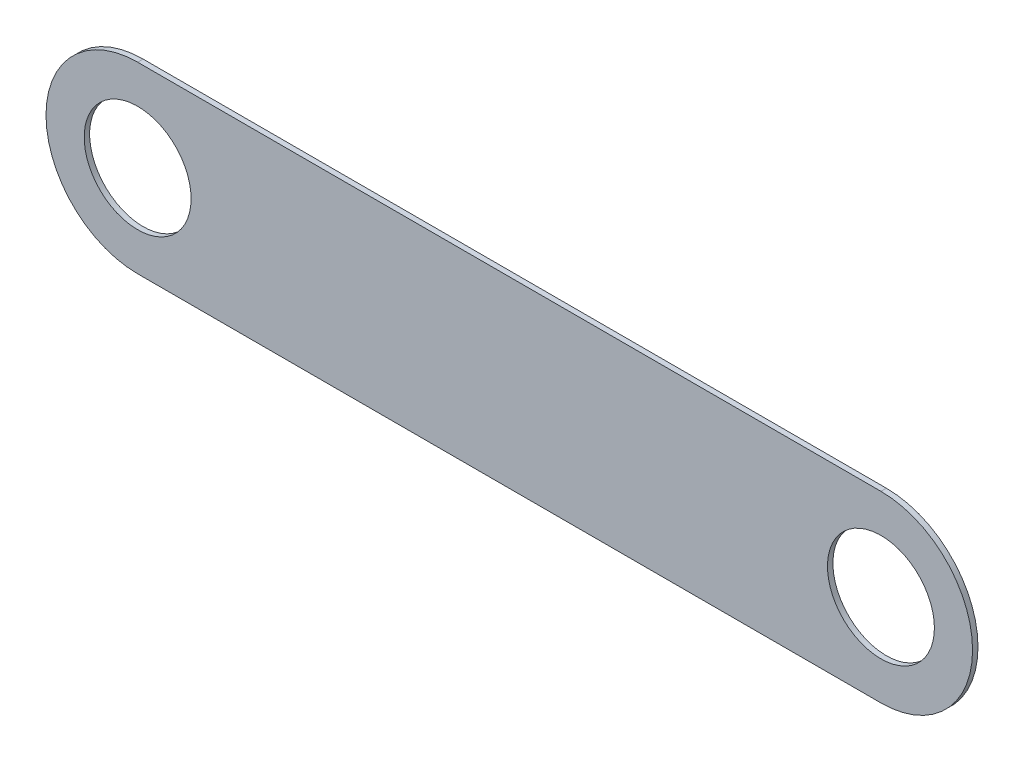
ISO-10303-21;
HEADER;
FILE_DESCRIPTION(('STEP AP214'),'2;1');
FILE_NAME('part.step','',(''),(''),'','','');
FILE_SCHEMA(('AUTOMOTIVE_DESIGN { 1 0 10303 214 1 1 1 1 }'));
ENDSEC;
DATA;
#1=APPLICATION_CONTEXT('core data for automotive mechanical design processes');
#2=APPLICATION_PROTOCOL_DEFINITION('international standard','automotive_design',2000,#1);
#3=PRODUCT_CONTEXT('',#1,'mechanical');
#4=PRODUCT('Part','Part','',(#3));
#5=PRODUCT_RELATED_PRODUCT_CATEGORY('part','',(#4));
#6=PRODUCT_DEFINITION_FORMATION('','',#4);
#7=PRODUCT_DEFINITION_CONTEXT('part definition',#1,'design');
#8=PRODUCT_DEFINITION('design','',#6,#7);
#9=PRODUCT_DEFINITION_SHAPE('','',#8);
#10=(LENGTH_UNIT() NAMED_UNIT(*) SI_UNIT(.MILLI.,.METRE.));
#11=(NAMED_UNIT(*) PLANE_ANGLE_UNIT() SI_UNIT($,.RADIAN.));
#12=(NAMED_UNIT(*) SI_UNIT($,.STERADIAN.) SOLID_ANGLE_UNIT());
#13=UNCERTAINTY_MEASURE_WITH_UNIT(LENGTH_MEASURE(1.E-05),#10,'distance_accuracy_value','');
#14=(GEOMETRIC_REPRESENTATION_CONTEXT(3) GLOBAL_UNCERTAINTY_ASSIGNED_CONTEXT((#13)) GLOBAL_UNIT_ASSIGNED_CONTEXT((#10,
#11,#12)) REPRESENTATION_CONTEXT('',''));
#15=CARTESIAN_POINT('',(0.,0.,0.));
#16=DIRECTION('',(0.,0.,1.));
#17=DIRECTION('',(1.,0.,0.));
#18=AXIS2_PLACEMENT_3D('',#15,#16,#17);
#19=CARTESIAN_POINT('',(115.3333736,94.6999884,0.));
#20=DIRECTION('',(0.,1.,0.));
#21=DIRECTION('',(1.,0.,0.));
#22=AXIS2_PLACEMENT_3D('',#19,#20,#21);
#23=PLANE('',#22);
#24=DIRECTION('',(1.,0.,0.));
#25=VECTOR('',#24,1.);
#26=CARTESIAN_POINT('',(115.3333736,94.6999884,0.03556));
#27=LINE('',#26,#25);
#28=CARTESIAN_POINT('',(115.3333736,94.6999884,0.03556));
#29=VERTEX_POINT('',#28);
#30=CARTESIAN_POINT('',(120.1999628,94.6999884,0.03556));
#31=VERTEX_POINT('',#30);
#32=EDGE_CURVE('E11',#29,#31,#27,.T.);
#33=ORIENTED_EDGE('',*,*,#32,.F.);
#34=DIRECTION('',(0.,0.,1.));
#35=VECTOR('',#34,1.);
#36=CARTESIAN_POINT('',(115.3333736,94.6999884,0.));
#37=LINE('',#36,#35);
#38=CARTESIAN_POINT('',(115.3333736,94.6999884,0.));
#39=VERTEX_POINT('',#38);
#40=EDGE_CURVE('E24',#39,#29,#37,.T.);
#41=ORIENTED_EDGE('',*,*,#40,.F.);
#42=DIRECTION('',(1.,0.,0.));
#43=VECTOR('',#42,1.);
#44=CARTESIAN_POINT('',(115.3333736,94.6999884,0.));
#45=LINE('',#44,#43);
#46=CARTESIAN_POINT('',(120.1999628,94.6999884,0.));
#47=VERTEX_POINT('',#46);
#48=EDGE_CURVE('E110',#39,#47,#45,.T.);
#49=ORIENTED_EDGE('',*,*,#48,.T.);
#50=DIRECTION('',(0.,0.,1.));
#51=VECTOR('',#50,1.);
#52=CARTESIAN_POINT('',(120.1999628,94.6999884,0.));
#53=LINE('',#52,#51);
#54=EDGE_CURVE('E37',#47,#31,#53,.T.);
#55=ORIENTED_EDGE('',*,*,#54,.T.);
#56=EDGE_LOOP('',(#33,#41,#49,#55));
#57=FACE_BOUND('',#56,.T.);
#58=ADVANCED_FACE('F17',(#57),#23,.F.);
#59=CARTESIAN_POINT('',(115.3333736,95.2999872,0.));
#60=DIRECTION('',(0.,0.,-1.));
#61=DIRECTION('',(0.,1.,0.));
#62=AXIS2_PLACEMENT_3D('',#59,#60,#61);
#63=CYLINDRICAL_SURFACE('',#62,0.599998799999999);
#64=CARTESIAN_POINT('',(115.3333736,95.2999872,0.03556));
#65=DIRECTION('',(0.,0.,1.));
#66=DIRECTION('',(0.,1.,0.));
#67=AXIS2_PLACEMENT_3D('',#64,#65,#66);
#68=CIRCLE('',#67,0.599998799999999);
#69=CARTESIAN_POINT('',(115.3333736,95.899986,0.03556));
#70=VERTEX_POINT('',#69);
#71=EDGE_CURVE('E106',#70,#29,#68,.T.);
#72=ORIENTED_EDGE('',*,*,#71,.F.);
#73=DIRECTION('',(0.,0.,1.));
#74=VECTOR('',#73,1.);
#75=CARTESIAN_POINT('',(115.3333736,95.899986,0.));
#76=LINE('',#75,#74);
#77=CARTESIAN_POINT('',(115.3333736,95.899986,0.));
#78=VERTEX_POINT('',#77);
#79=EDGE_CURVE('E104',#78,#70,#76,.T.);
#80=ORIENTED_EDGE('',*,*,#79,.F.);
#81=CARTESIAN_POINT('',(115.3333736,95.2999872,0.));
#82=DIRECTION('',(0.,0.,1.));
#83=DIRECTION('',(0.,1.,0.));
#84=AXIS2_PLACEMENT_3D('',#81,#82,#83);
#85=CIRCLE('',#84,0.599998799999999);
#86=EDGE_CURVE('E102',#78,#39,#85,.T.);
#87=ORIENTED_EDGE('',*,*,#86,.T.);
#88=ORIENTED_EDGE('',*,*,#40,.T.);
#89=EDGE_LOOP('',(#72,#80,#87,#88));
#90=FACE_BOUND('',#89,.T.);
#91=ADVANCED_FACE('F126',(#90),#63,.T.);
#92=CARTESIAN_POINT('',(120.1999628,95.2999872,0.));
#93=DIRECTION('',(0.,0.,-1.));
#94=DIRECTION('',(0.,-1.,0.));
#95=AXIS2_PLACEMENT_3D('',#92,#93,#94);
#96=CYLINDRICAL_SURFACE('',#95,0.599998799999999);
#97=CARTESIAN_POINT('',(120.1999628,95.2999872,0.03556));
#98=DIRECTION('',(0.,0.,1.));
#99=DIRECTION('',(0.,-1.,0.));
#100=AXIS2_PLACEMENT_3D('',#97,#98,#99);
#101=CIRCLE('',#100,0.599998799999999);
#102=CARTESIAN_POINT('',(120.1999628,95.899986,0.03556));
#103=VERTEX_POINT('',#102);
#104=EDGE_CURVE('E99',#31,#103,#101,.T.);
#105=ORIENTED_EDGE('',*,*,#104,.F.);
#106=ORIENTED_EDGE('',*,*,#54,.F.);
#107=CARTESIAN_POINT('',(120.1999628,95.2999872,0.));
#108=DIRECTION('',(0.,0.,1.));
#109=DIRECTION('',(0.,-1.,0.));
#110=AXIS2_PLACEMENT_3D('',#107,#108,#109);
#111=CIRCLE('',#110,0.599998799999999);
#112=CARTESIAN_POINT('',(120.1999628,95.899986,0.));
#113=VERTEX_POINT('',#112);
#114=EDGE_CURVE('E96',#47,#113,#111,.T.);
#115=ORIENTED_EDGE('',*,*,#114,.T.);
#116=DIRECTION('',(0.,0.,1.));
#117=VECTOR('',#116,1.);
#118=CARTESIAN_POINT('',(120.1999628,95.899986,0.));
#119=LINE('',#118,#117);
#120=EDGE_CURVE('E94',#113,#103,#119,.T.);
#121=ORIENTED_EDGE('',*,*,#120,.T.);
#122=EDGE_LOOP('',(#105,#106,#115,#121));
#123=FACE_BOUND('',#122,.T.);
#124=ADVANCED_FACE('F119',(#123),#96,.T.);
#125=CARTESIAN_POINT('',(120.1999628,95.899986,0.));
#126=DIRECTION('',(0.,-1.,0.));
#127=DIRECTION('',(-1.,0.,0.));
#128=AXIS2_PLACEMENT_3D('',#125,#126,#127);
#129=PLANE('',#128);
#130=DIRECTION('',(-1.,0.,0.));
#131=VECTOR('',#130,1.);
#132=CARTESIAN_POINT('',(120.1999628,95.899986,0.03556));
#133=LINE('',#132,#131);
#134=EDGE_CURVE('E91',#103,#70,#133,.T.);
#135=ORIENTED_EDGE('',*,*,#134,.F.);
#136=ORIENTED_EDGE('',*,*,#120,.F.);
#137=DIRECTION('',(-1.,0.,0.));
#138=VECTOR('',#137,1.);
#139=CARTESIAN_POINT('',(120.1999628,95.899986,0.));
#140=LINE('',#139,#138);
#141=EDGE_CURVE('E88',#113,#78,#140,.T.);
#142=ORIENTED_EDGE('',*,*,#141,.T.);
#143=ORIENTED_EDGE('',*,*,#79,.T.);
#144=EDGE_LOOP('',(#135,#136,#142,#143));
#145=FACE_BOUND('',#144,.T.);
#146=ADVANCED_FACE('F125',(#145),#129,.F.);
#147=CARTESIAN_POINT('',(115.3333736,95.2999872,0.));
#148=DIRECTION('',(0.,0.,-1.));
#149=DIRECTION('',(1.,0.,0.));
#150=AXIS2_PLACEMENT_3D('',#147,#148,#149);
#151=CYLINDRICAL_SURFACE('',#150,0.3499993);
#152=DIRECTION('',(0.,0.,1.));
#153=VECTOR('',#152,1.);
#154=CARTESIAN_POINT('',(115.6833729,95.2999872,0.));
#155=LINE('',#154,#153);
#156=CARTESIAN_POINT('',(115.6833729,95.2999872,0.));
#157=VERTEX_POINT('',#156);
#158=CARTESIAN_POINT('',(115.6833729,95.2999872,0.03556));
#159=VERTEX_POINT('',#158);
#160=EDGE_CURVE('E86',#157,#159,#155,.T.);
#161=ORIENTED_EDGE('',*,*,#160,.T.);
#162=CARTESIAN_POINT('',(115.3333736,95.2999872,0.03556));
#163=DIRECTION('',(0.,0.,1.));
#164=DIRECTION('',(1.,0.,0.));
#165=AXIS2_PLACEMENT_3D('',#162,#163,#164);
#166=CIRCLE('',#165,0.3499993);
#167=EDGE_CURVE('E83',#159,#159,#166,.T.);
#168=ORIENTED_EDGE('',*,*,#167,.T.);
#169=ORIENTED_EDGE('',*,*,#160,.F.);
#170=CARTESIAN_POINT('',(115.3333736,95.2999872,0.));
#171=DIRECTION('',(0.,0.,1.));
#172=DIRECTION('',(1.,0.,0.));
#173=AXIS2_PLACEMENT_3D('',#170,#171,#172);
#174=CIRCLE('',#173,0.3499993);
#175=EDGE_CURVE('E74',#157,#157,#174,.T.);
#176=ORIENTED_EDGE('',*,*,#175,.F.);
#177=EDGE_LOOP('',(#161,#168,#169,#176));
#178=FACE_BOUND('',#177,.T.);
#179=ADVANCED_FACE('F137',(#178),#151,.F.);
#180=CARTESIAN_POINT('',(120.2000136,95.300038,0.));
#181=DIRECTION('',(0.,0.,-1.));
#182=DIRECTION('',(1.,0.,0.));
#183=AXIS2_PLACEMENT_3D('',#180,#181,#182);
#184=CYLINDRICAL_SURFACE('',#183,0.3499993);
#185=DIRECTION('',(0.,0.,1.));
#186=VECTOR('',#185,1.);
#187=CARTESIAN_POINT('',(120.5500129,95.300038,0.));
#188=LINE('',#187,#186);
#189=CARTESIAN_POINT('',(120.5500129,95.300038,0.));
#190=VERTEX_POINT('',#189);
#191=CARTESIAN_POINT('',(120.5500129,95.300038,0.03556));
#192=VERTEX_POINT('',#191);
#193=EDGE_CURVE('E68',#190,#192,#188,.T.);
#194=ORIENTED_EDGE('',*,*,#193,.T.);
#195=CARTESIAN_POINT('',(120.2000136,95.300038,0.03556));
#196=DIRECTION('',(0.,0.,1.));
#197=DIRECTION('',(1.,0.,0.));
#198=AXIS2_PLACEMENT_3D('',#195,#196,#197);
#199=CIRCLE('',#198,0.3499993);
#200=EDGE_CURVE('E73',#192,#192,#199,.T.);
#201=ORIENTED_EDGE('',*,*,#200,.T.);
#202=ORIENTED_EDGE('',*,*,#193,.F.);
#203=CARTESIAN_POINT('',(120.2000136,95.300038,0.));
#204=DIRECTION('',(0.,0.,1.));
#205=DIRECTION('',(1.,0.,0.));
#206=AXIS2_PLACEMENT_3D('',#203,#204,#205);
#207=CIRCLE('',#206,0.3499993);
#208=EDGE_CURVE('E71',#190,#190,#207,.T.);
#209=ORIENTED_EDGE('',*,*,#208,.F.);
#210=EDGE_LOOP('',(#194,#201,#202,#209));
#211=FACE_BOUND('',#210,.T.);
#212=ADVANCED_FACE('F70',(#211),#184,.F.);
#213=CARTESIAN_POINT('',(115.3333736,94.6999884,0.));
#214=DIRECTION('',(0.,0.,-1.));
#215=DIRECTION('',(-1.,0.,0.));
#216=AXIS2_PLACEMENT_3D('',#213,#214,#215);
#217=PLANE('',#216);
#218=ORIENTED_EDGE('',*,*,#48,.F.);
#219=ORIENTED_EDGE('',*,*,#86,.F.);
#220=ORIENTED_EDGE('',*,*,#141,.F.);
#221=ORIENTED_EDGE('',*,*,#114,.F.);
#222=EDGE_LOOP('',(#218,#219,#220,#221));
#223=FACE_BOUND('',#222,.T.);
#224=ORIENTED_EDGE('',*,*,#175,.T.);
#225=EDGE_LOOP('',(#224));
#226=FACE_BOUND('',#225,.T.);
#227=ORIENTED_EDGE('',*,*,#208,.T.);
#228=EDGE_LOOP('',(#227));
#229=FACE_BOUND('',#228,.T.);
#230=ADVANCED_FACE('F77',(#223,#226,#229),#217,.T.);
#231=CARTESIAN_POINT('',(115.3333736,94.6999884,0.03556));
#232=DIRECTION('',(0.,0.,-1.));
#233=DIRECTION('',(-1.,0.,0.));
#234=AXIS2_PLACEMENT_3D('',#231,#232,#233);
#235=PLANE('',#234);
#236=ORIENTED_EDGE('',*,*,#134,.T.);
#237=ORIENTED_EDGE('',*,*,#71,.T.);
#238=ORIENTED_EDGE('',*,*,#32,.T.);
#239=ORIENTED_EDGE('',*,*,#104,.T.);
#240=EDGE_LOOP('',(#236,#237,#238,#239));
#241=FACE_BOUND('',#240,.T.);
#242=ORIENTED_EDGE('',*,*,#167,.F.);
#243=EDGE_LOOP('',(#242));
#244=FACE_BOUND('',#243,.T.);
#245=ORIENTED_EDGE('',*,*,#200,.F.);
#246=EDGE_LOOP('',(#245));
#247=FACE_BOUND('',#246,.T.);
#248=ADVANCED_FACE('F122',(#241,#244,#247),#235,.F.);
#249=CLOSED_SHELL('',(#58,#91,#124,#146,#179,#212,#230,#248));
#250=MANIFOLD_SOLID_BREP('B1',#249);
#251=ADVANCED_BREP_SHAPE_REPRESENTATION('',(#18,#250),#14);
#252=SHAPE_DEFINITION_REPRESENTATION(#9,#251);
ENDSEC;
END-ISO-10303-21;
